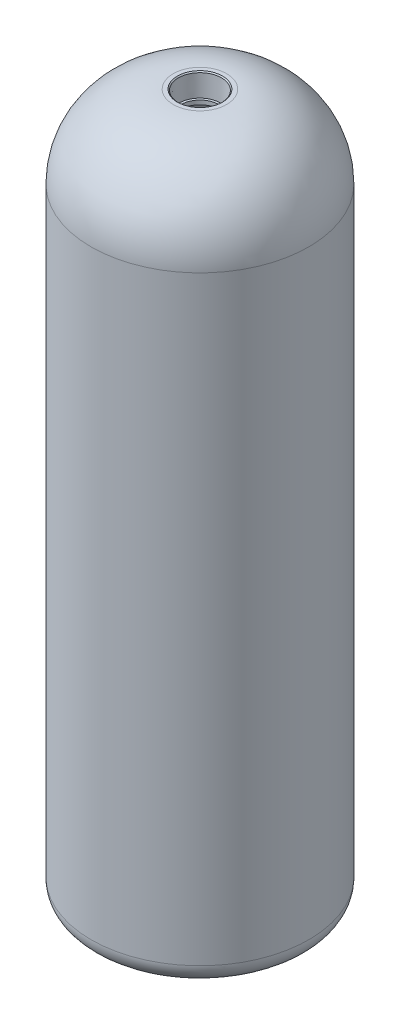
ISO-10303-21;
HEADER;
FILE_DESCRIPTION(('STEP AP214'),'2;1');
FILE_NAME('part.step','',(''),(''),'','','');
FILE_SCHEMA(('AUTOMOTIVE_DESIGN { 1 0 10303 214 1 1 1 1 }'));
ENDSEC;
DATA;
#1=APPLICATION_CONTEXT('core data for automotive mechanical design processes');
#2=APPLICATION_PROTOCOL_DEFINITION('international standard','automotive_design',2000,#1);
#3=PRODUCT_CONTEXT('',#1,'mechanical');
#4=PRODUCT('Part','Part','',(#3));
#5=PRODUCT_RELATED_PRODUCT_CATEGORY('part','',(#4));
#6=PRODUCT_DEFINITION_FORMATION('','',#4);
#7=PRODUCT_DEFINITION_CONTEXT('part definition',#1,'design');
#8=PRODUCT_DEFINITION('design','',#6,#7);
#9=PRODUCT_DEFINITION_SHAPE('','',#8);
#10=(LENGTH_UNIT() NAMED_UNIT(*) SI_UNIT(.MILLI.,.METRE.));
#11=(NAMED_UNIT(*) PLANE_ANGLE_UNIT() SI_UNIT($,.RADIAN.));
#12=(NAMED_UNIT(*) SI_UNIT($,.STERADIAN.) SOLID_ANGLE_UNIT());
#13=UNCERTAINTY_MEASURE_WITH_UNIT(LENGTH_MEASURE(1.E-05),#10,'distance_accuracy_value','');
#14=(GEOMETRIC_REPRESENTATION_CONTEXT(3) GLOBAL_UNCERTAINTY_ASSIGNED_CONTEXT((#13)) GLOBAL_UNIT_ASSIGNED_CONTEXT((#10,
#11,#12)) REPRESENTATION_CONTEXT('',''));
#15=CARTESIAN_POINT('',(0.,0.,0.));
#16=DIRECTION('',(0.,0.,1.));
#17=DIRECTION('',(1.,0.,0.));
#18=AXIS2_PLACEMENT_3D('',#15,#16,#17);
#19=CARTESIAN_POINT('',(0.,434.34,0.));
#20=DIRECTION('',(0.,-1.,0.));
#21=DIRECTION('',(0.,0.,-1.));
#22=AXIS2_PLACEMENT_3D('',#19,#20,#21);
#23=PLANE('',#22);
#24=CARTESIAN_POINT('',(0.,434.34,0.));
#25=DIRECTION('',(0.,1.,0.));
#26=DIRECTION('',(0.,0.,1.));
#27=AXIS2_PLACEMENT_3D('',#24,#25,#26);
#28=CIRCLE('',#27,13.9674854);
#29=CARTESIAN_POINT('',(0.,434.34,13.9674854));
#30=VERTEX_POINT('',#29);
#31=EDGE_CURVE('E75',#30,#30,#28,.T.);
#32=ORIENTED_EDGE('',*,*,#31,.F.);
#33=EDGE_LOOP('',(#32));
#34=FACE_BOUND('',#33,.T.);
#35=CARTESIAN_POINT('',(0.,434.34,0.));
#36=DIRECTION('',(0.,1.,0.));
#37=DIRECTION('',(0.,0.,1.));
#38=AXIS2_PLACEMENT_3D('',#35,#36,#37);
#39=CIRCLE('',#38,16.51);
#40=CARTESIAN_POINT('',(0.,434.34,16.51));
#41=VERTEX_POINT('',#40);
#42=EDGE_CURVE('E10',#41,#41,#39,.T.);
#43=ORIENTED_EDGE('',*,*,#42,.T.);
#44=EDGE_LOOP('',(#43));
#45=FACE_BOUND('',#44,.T.);
#46=ADVANCED_FACE('F35',(#34,#45),#23,.F.);
#47=CARTESIAN_POINT('',(0.,383.54,0.));
#48=DIRECTION('',(0.,1.,0.));
#49=DIRECTION('',(0.,0.,1.));
#50=AXIS2_PLACEMENT_3D('',#47,#48,#49);
#51=DEGENERATE_TOROIDAL_SURFACE('',#50,16.51,50.8,.T.);
#52=ORIENTED_EDGE('',*,*,#42,.F.);
#53=EDGE_LOOP('',(#52));
#54=FACE_BOUND('',#53,.T.);
#55=CARTESIAN_POINT('',(0.,383.54,0.));
#56=DIRECTION('',(0.,1.,0.));
#57=DIRECTION('',(0.,0.,1.));
#58=AXIS2_PLACEMENT_3D('',#55,#56,#57);
#59=CIRCLE('',#58,67.31);
#60=CARTESIAN_POINT('',(0.,383.54,67.31));
#61=VERTEX_POINT('',#60);
#62=EDGE_CURVE('E42',#61,#61,#59,.T.);
#63=ORIENTED_EDGE('',*,*,#62,.T.);
#64=EDGE_LOOP('',(#63));
#65=FACE_BOUND('',#64,.T.);
#66=ADVANCED_FACE('F82',(#54,#65),#51,.T.);
#67=CARTESIAN_POINT('',(0.,434.34,0.));
#68=DIRECTION('',(0.,1.,0.));
#69=DIRECTION('',(0.,0.,1.));
#70=AXIS2_PLACEMENT_3D('',#67,#68,#69);
#71=CYLINDRICAL_SURFACE('',#70,67.31);
#72=ORIENTED_EDGE('',*,*,#62,.F.);
#73=EDGE_LOOP('',(#72));
#74=FACE_BOUND('',#73,.T.);
#75=CARTESIAN_POINT('',(0.,12.7000000000001,0.));
#76=DIRECTION('',(0.,1.,0.));
#77=DIRECTION('',(0.,0.,1.));
#78=AXIS2_PLACEMENT_3D('',#75,#76,#77);
#79=CIRCLE('',#78,67.31);
#80=CARTESIAN_POINT('',(0.,12.7000000000001,67.31));
#81=VERTEX_POINT('',#80);
#82=EDGE_CURVE('E46',#81,#81,#79,.T.);
#83=ORIENTED_EDGE('',*,*,#82,.T.);
#84=EDGE_LOOP('',(#83));
#85=FACE_BOUND('',#84,.T.);
#86=ADVANCED_FACE('F86',(#74,#85),#71,.T.);
#87=CARTESIAN_POINT('',(0.,12.7,0.));
#88=DIRECTION('',(0.,1.,0.));
#89=DIRECTION('',(0.,0.,1.));
#90=AXIS2_PLACEMENT_3D('',#87,#88,#89);
#91=TOROIDAL_SURFACE('',#90,54.61,12.7);
#92=ORIENTED_EDGE('',*,*,#82,.F.);
#93=EDGE_LOOP('',(#92));
#94=FACE_BOUND('',#93,.T.);
#95=CARTESIAN_POINT('',(0.,0.,0.));
#96=DIRECTION('',(0.,1.,0.));
#97=DIRECTION('',(0.,0.,1.));
#98=AXIS2_PLACEMENT_3D('',#95,#96,#97);
#99=CIRCLE('',#98,54.6099999999999);
#100=CARTESIAN_POINT('',(0.,0.,54.6099999999999));
#101=VERTEX_POINT('',#100);
#102=EDGE_CURVE('E51',#101,#101,#99,.T.);
#103=ORIENTED_EDGE('',*,*,#102,.T.);
#104=EDGE_LOOP('',(#103));
#105=FACE_BOUND('',#104,.T.);
#106=ADVANCED_FACE('F91',(#94,#105),#91,.T.);
#107=CARTESIAN_POINT('',(0.,0.,0.));
#108=DIRECTION('',(0.,1.,0.));
#109=DIRECTION('',(0.,0.,1.));
#110=AXIS2_PLACEMENT_3D('',#107,#108,#109);
#111=PLANE('',#110);
#112=ORIENTED_EDGE('',*,*,#102,.F.);
#113=EDGE_LOOP('',(#112));
#114=FACE_BOUND('',#113,.T.);
#115=ADVANCED_FACE('F98',(#114),#111,.F.);
#116=CARTESIAN_POINT('',(0.,434.34,0.));
#117=DIRECTION('',(0.,1.,0.));
#118=DIRECTION('',(0.,0.,1.));
#119=AXIS2_PLACEMENT_3D('',#116,#117,#118);
#120=CYLINDRICAL_SURFACE('',#119,11.5062);
#121=CARTESIAN_POINT('',(0.,417.83,0.));
#122=DIRECTION('',(0.,-1.,0.));
#123=DIRECTION('',(0.,0.,-1.));
#124=AXIS2_PLACEMENT_3D('',#121,#122,#123);
#125=CIRCLE('',#124,11.5062);
#126=CARTESIAN_POINT('',(0.,417.83,-11.5062));
#127=VERTEX_POINT('',#126);
#128=EDGE_CURVE('E38',#127,#127,#125,.T.);
#129=ORIENTED_EDGE('',*,*,#128,.T.);
#130=EDGE_LOOP('',(#129));
#131=FACE_BOUND('',#130,.T.);
#132=CARTESIAN_POINT('',(0.,420.37,0.));
#133=DIRECTION('',(0.,1.,0.));
#134=DIRECTION('',(0.,0.,1.));
#135=AXIS2_PLACEMENT_3D('',#132,#133,#134);
#136=CIRCLE('',#135,11.5062);
#137=CARTESIAN_POINT('',(0.,420.37,11.5062));
#138=VERTEX_POINT('',#137);
#139=EDGE_CURVE('E66',#138,#138,#136,.T.);
#140=ORIENTED_EDGE('',*,*,#139,.T.);
#141=EDGE_LOOP('',(#140));
#142=FACE_BOUND('',#141,.T.);
#143=ADVANCED_FACE('F102',(#131,#142),#120,.F.);
#144=CARTESIAN_POINT('',(11.5062,420.37,0.));
#145=DIRECTION('',(0.,-1.,0.));
#146=DIRECTION('',(0.,0.,-1.));
#147=AXIS2_PLACEMENT_3D('',#144,#145,#146);
#148=PLANE('',#147);
#149=ORIENTED_EDGE('',*,*,#139,.F.);
#150=EDGE_LOOP('',(#149));
#151=FACE_BOUND('',#150,.T.);
#152=CARTESIAN_POINT('',(0.,420.37,0.));
#153=DIRECTION('',(0.,1.,0.));
#154=DIRECTION('',(0.,0.,1.));
#155=AXIS2_PLACEMENT_3D('',#152,#153,#154);
#156=CIRCLE('',#155,12.933217642161);
#157=CARTESIAN_POINT('',(0.,420.37,12.933217642161));
#158=VERTEX_POINT('',#157);
#159=EDGE_CURVE('E69',#158,#158,#156,.T.);
#160=ORIENTED_EDGE('',*,*,#159,.T.);
#161=EDGE_LOOP('',(#160));
#162=FACE_BOUND('',#161,.T.);
#163=ADVANCED_FACE('F126',(#151,#162),#148,.F.);
#164=CARTESIAN_POINT('',(0.,433.705,0.));
#165=DIRECTION('',(0.,1.,0.));
#166=DIRECTION('',(0.,0.,1.));
#167=AXIS2_PLACEMENT_3D('',#164,#165,#166);
#168=CONICAL_SURFACE('',#167,13.3324854,0.0299323966717034);
#169=ORIENTED_EDGE('',*,*,#159,.F.);
#170=EDGE_LOOP('',(#169));
#171=FACE_BOUND('',#170,.T.);
#172=CARTESIAN_POINT('',(0.,433.705,0.));
#173=DIRECTION('',(0.,1.,0.));
#174=DIRECTION('',(0.,0.,1.));
#175=AXIS2_PLACEMENT_3D('',#172,#173,#174);
#176=CIRCLE('',#175,13.3324854);
#177=CARTESIAN_POINT('',(0.,433.705,13.3324854));
#178=VERTEX_POINT('',#177);
#179=EDGE_CURVE('E72',#178,#178,#176,.T.);
#180=ORIENTED_EDGE('',*,*,#179,.T.);
#181=EDGE_LOOP('',(#180));
#182=FACE_BOUND('',#181,.T.);
#183=ADVANCED_FACE('F130',(#171,#182),#168,.F.);
#184=CARTESIAN_POINT('',(0.,434.34,0.));
#185=DIRECTION('',(0.,1.,0.));
#186=DIRECTION('',(0.,0.,1.));
#187=AXIS2_PLACEMENT_3D('',#184,#185,#186);
#188=CONICAL_SURFACE('',#187,13.9674854,0.785398163397451);
#189=ORIENTED_EDGE('',*,*,#179,.F.);
#190=EDGE_LOOP('',(#189));
#191=FACE_BOUND('',#190,.T.);
#192=ORIENTED_EDGE('',*,*,#31,.T.);
#193=EDGE_LOOP('',(#192));
#194=FACE_BOUND('',#193,.T.);
#195=ADVANCED_FACE('F79',(#191,#194),#188,.F.);
#196=CARTESIAN_POINT('',(0.,16.51,0.));
#197=DIRECTION('',(0.,-1.,0.));
#198=DIRECTION('',(0.,0.,-1.));
#199=AXIS2_PLACEMENT_3D('',#196,#197,#198);
#200=PLANE('',#199);
#201=CARTESIAN_POINT('',(0.,16.51,0.));
#202=DIRECTION('',(0.,1.,0.));
#203=DIRECTION('',(0.,0.,1.));
#204=AXIS2_PLACEMENT_3D('',#201,#202,#203);
#205=CIRCLE('',#204,38.0999999999999);
#206=CARTESIAN_POINT('',(0.,16.51,38.0999999999999));
#207=VERTEX_POINT('',#206);
#208=EDGE_CURVE('E54',#207,#207,#205,.T.);
#209=ORIENTED_EDGE('',*,*,#208,.T.);
#210=EDGE_LOOP('',(#209));
#211=FACE_BOUND('',#210,.T.);
#212=ADVANCED_FACE('F104',(#211),#200,.F.);
#213=CARTESIAN_POINT('',(0.,29.21,0.));
#214=DIRECTION('',(0.,1.,0.));
#215=DIRECTION('',(0.,0.,1.));
#216=AXIS2_PLACEMENT_3D('',#213,#214,#215);
#217=TOROIDAL_SURFACE('',#216,38.1,12.7);
#218=CARTESIAN_POINT('',(0.,29.2100000000001,0.));
#219=DIRECTION('',(0.,1.,0.));
#220=DIRECTION('',(0.,0.,1.));
#221=AXIS2_PLACEMENT_3D('',#218,#219,#220);
#222=CIRCLE('',#221,50.7999999999999);
#223=CARTESIAN_POINT('',(0.,29.2100000000001,50.7999999999999));
#224=VERTEX_POINT('',#223);
#225=EDGE_CURVE('E57',#224,#224,#222,.T.);
#226=ORIENTED_EDGE('',*,*,#225,.T.);
#227=EDGE_LOOP('',(#226));
#228=FACE_BOUND('',#227,.T.);
#229=ORIENTED_EDGE('',*,*,#208,.F.);
#230=EDGE_LOOP('',(#229));
#231=FACE_BOUND('',#230,.T.);
#232=ADVANCED_FACE('F107',(#228,#231),#217,.F.);
#233=CARTESIAN_POINT('',(0.,434.34,0.));
#234=DIRECTION('',(0.,1.,0.));
#235=DIRECTION('',(0.,0.,1.));
#236=AXIS2_PLACEMENT_3D('',#233,#234,#235);
#237=CYLINDRICAL_SURFACE('',#236,50.8);
#238=ORIENTED_EDGE('',*,*,#225,.F.);
#239=EDGE_LOOP('',(#238));
#240=FACE_BOUND('',#239,.T.);
#241=CARTESIAN_POINT('',(0.,379.73,0.));
#242=DIRECTION('',(0.,1.,0.));
#243=DIRECTION('',(0.,0.,1.));
#244=AXIS2_PLACEMENT_3D('',#241,#242,#243);
#245=CIRCLE('',#244,50.8);
#246=CARTESIAN_POINT('',(0.,379.73,50.8));
#247=VERTEX_POINT('',#246);
#248=EDGE_CURVE('E60',#247,#247,#245,.T.);
#249=ORIENTED_EDGE('',*,*,#248,.T.);
#250=EDGE_LOOP('',(#249));
#251=FACE_BOUND('',#250,.T.);
#252=ADVANCED_FACE('F111',(#240,#251),#237,.F.);
#253=CARTESIAN_POINT('',(0.,379.73,0.));
#254=DIRECTION('',(0.,1.,0.));
#255=DIRECTION('',(0.,0.,1.));
#256=AXIS2_PLACEMENT_3D('',#253,#254,#255);
#257=DEGENERATE_TOROIDAL_SURFACE('',#256,12.7,38.1,.T.);
#258=CARTESIAN_POINT('',(0.,417.83,0.));
#259=DIRECTION('',(0.,1.,0.));
#260=DIRECTION('',(0.,0.,1.));
#261=AXIS2_PLACEMENT_3D('',#258,#259,#260);
#262=CIRCLE('',#261,12.7);
#263=CARTESIAN_POINT('',(0.,417.83,12.7));
#264=VERTEX_POINT('',#263);
#265=EDGE_CURVE('E63',#264,#264,#262,.T.);
#266=ORIENTED_EDGE('',*,*,#265,.T.);
#267=EDGE_LOOP('',(#266));
#268=FACE_BOUND('',#267,.T.);
#269=ORIENTED_EDGE('',*,*,#248,.F.);
#270=EDGE_LOOP('',(#269));
#271=FACE_BOUND('',#270,.T.);
#272=ADVANCED_FACE('F115',(#268,#271),#257,.F.);
#273=CARTESIAN_POINT('',(0.,417.83,1.82631687550838E-12));
#274=DIRECTION('',(0.,-1.,0.));
#275=DIRECTION('',(0.,0.,-1.));
#276=AXIS2_PLACEMENT_3D('',#273,#274,#275);
#277=PLANE('',#276);
#278=ORIENTED_EDGE('',*,*,#128,.F.);
#279=EDGE_LOOP('',(#278));
#280=FACE_BOUND('',#279,.T.);
#281=ORIENTED_EDGE('',*,*,#265,.F.);
#282=EDGE_LOOP('',(#281));
#283=FACE_BOUND('',#282,.T.);
#284=ADVANCED_FACE('F119',(#280,#283),#277,.T.);
#285=CLOSED_SHELL('',(#46,#66,#86,#106,#115,#143,#163,#183,#195,#212,#232,#252,#272,#284));
#286=MANIFOLD_SOLID_BREP('B2',#285);
#287=ADVANCED_BREP_SHAPE_REPRESENTATION('',(#18,#286),#14);
#288=SHAPE_DEFINITION_REPRESENTATION(#9,#287);
ENDSEC;
END-ISO-10303-21;
